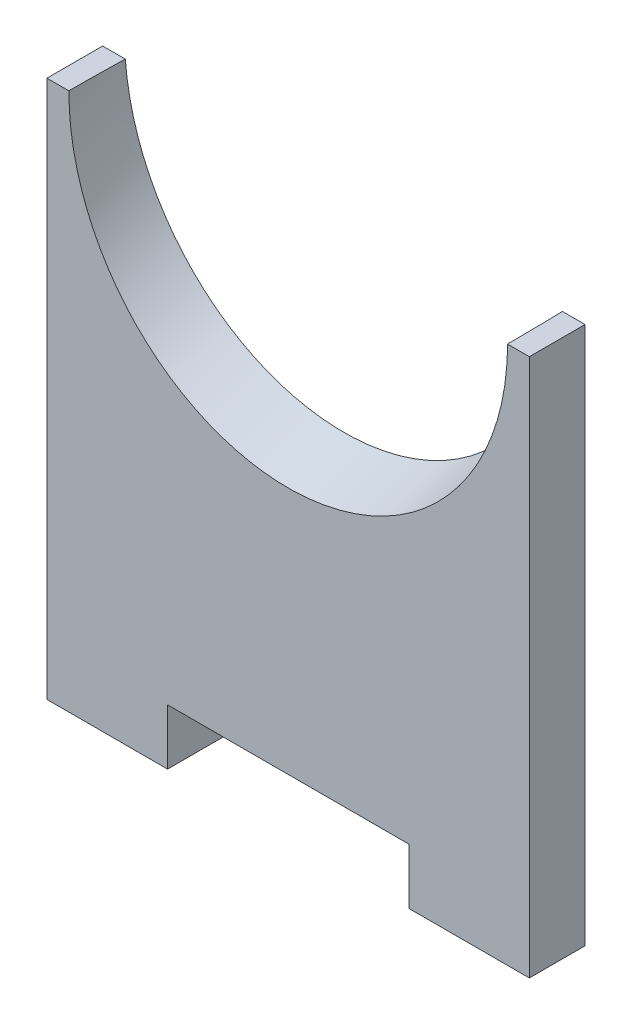
ISO-10303-21;
HEADER;
FILE_DESCRIPTION(('STEP AP214'),'2;1');
FILE_NAME('part.step','',(''),(''),'','','');
FILE_SCHEMA(('AUTOMOTIVE_DESIGN { 1 0 10303 214 1 1 1 1 }'));
ENDSEC;
DATA;
#1=APPLICATION_CONTEXT('core data for automotive mechanical design processes');
#2=APPLICATION_PROTOCOL_DEFINITION('international standard','automotive_design',2000,#1);
#3=PRODUCT_CONTEXT('',#1,'mechanical');
#4=PRODUCT('Part','Part','',(#3));
#5=PRODUCT_RELATED_PRODUCT_CATEGORY('part','',(#4));
#6=PRODUCT_DEFINITION_FORMATION('','',#4);
#7=PRODUCT_DEFINITION_CONTEXT('part definition',#1,'design');
#8=PRODUCT_DEFINITION('design','',#6,#7);
#9=PRODUCT_DEFINITION_SHAPE('','',#8);
#10=(LENGTH_UNIT() NAMED_UNIT(*) SI_UNIT(.MILLI.,.METRE.));
#11=(NAMED_UNIT(*) PLANE_ANGLE_UNIT() SI_UNIT($,.RADIAN.));
#12=(NAMED_UNIT(*) SI_UNIT($,.STERADIAN.) SOLID_ANGLE_UNIT());
#13=UNCERTAINTY_MEASURE_WITH_UNIT(LENGTH_MEASURE(1.E-05),#10,'distance_accuracy_value','');
#14=(GEOMETRIC_REPRESENTATION_CONTEXT(3) GLOBAL_UNCERTAINTY_ASSIGNED_CONTEXT((#13)) GLOBAL_UNIT_ASSIGNED_CONTEXT((#10,
#11,#12)) REPRESENTATION_CONTEXT('',''));
#15=CARTESIAN_POINT('',(0.,0.,0.));
#16=DIRECTION('',(0.,0.,1.));
#17=DIRECTION('',(1.,0.,0.));
#18=AXIS2_PLACEMENT_3D('',#15,#16,#17);
#19=CARTESIAN_POINT('',(0.,54.999999982,6.35));
#20=DIRECTION('',(0.,-1.,0.));
#21=DIRECTION('',(1.,0.,0.));
#22=AXIS2_PLACEMENT_3D('',#19,#20,#21);
#23=PLANE('',#22);
#24=DIRECTION('',(-1.,0.,0.));
#25=VECTOR('',#24,1.);
#26=CARTESIAN_POINT('',(0.,54.999999982,6.35));
#27=LINE('',#26,#25);
#28=CARTESIAN_POINT('',(2.50020594541714,54.999999982,6.35));
#29=VERTEX_POINT('',#28);
#30=CARTESIAN_POINT('',(0.,54.999999982,6.35));
#31=VERTEX_POINT('',#30);
#32=EDGE_CURVE('E55',#29,#31,#27,.T.);
#33=ORIENTED_EDGE('',*,*,#32,.F.);
#34=CARTESIAN_POINT('',(27.499999991,54.999999982,6.0532723342948));
#35=DIRECTION('',(0.,-1.,0.));
#36=DIRECTION('',(0.,0.,1.));
#37=AXIS2_PLACEMENT_3D('',#34,#35,#36);
#38=ELLIPSE('',#37,73.0951101151822,25.000000038);
#39=CARTESIAN_POINT('',(2.5858736818512,54.999999982,0.));
#40=VERTEX_POINT('',#39);
#41=EDGE_CURVE('E201',#29,#40,#38,.T.);
#42=ORIENTED_EDGE('',*,*,#41,.T.);
#43=DIRECTION('',(-1.,0.,0.));
#44=VECTOR('',#43,1.);
#45=CARTESIAN_POINT('',(0.,54.999999982,0.));
#46=LINE('',#45,#44);
#47=CARTESIAN_POINT('',(0.,54.999999982,0.));
#48=VERTEX_POINT('',#47);
#49=EDGE_CURVE('E90',#40,#48,#46,.T.);
#50=ORIENTED_EDGE('',*,*,#49,.T.);
#51=DIRECTION('',(0.,0.,-1.));
#52=VECTOR('',#51,1.);
#53=CARTESIAN_POINT('',(0.,54.999999982,6.35));
#54=LINE('',#53,#52);
#55=EDGE_CURVE('E145',#31,#48,#54,.T.);
#56=ORIENTED_EDGE('',*,*,#55,.F.);
#57=EDGE_LOOP('',(#33,#42,#50,#56));
#58=FACE_BOUND('',#57,.T.);
#59=ADVANCED_FACE('F32',(#58),#23,.F.);
#60=CARTESIAN_POINT('',(0.,-6.35,6.35));
#61=DIRECTION('',(0.,1.,0.));
#62=DIRECTION('',(0.,0.,1.));
#63=AXIS2_PLACEMENT_3D('',#60,#61,#62);
#64=PLANE('',#63);
#65=DIRECTION('',(1.,0.,0.));
#66=VECTOR('',#65,1.);
#67=CARTESIAN_POINT('',(0.,-6.35,0.));
#68=LINE('',#67,#66);
#69=CARTESIAN_POINT('',(0.,-6.35,0.));
#70=VERTEX_POINT('',#69);
#71=CARTESIAN_POINT('',(13.7499999955,-6.35,0.));
#72=VERTEX_POINT('',#71);
#73=EDGE_CURVE('E146',#70,#72,#68,.T.);
#74=ORIENTED_EDGE('',*,*,#73,.T.);
#75=DIRECTION('',(0.,0.,-1.));
#76=VECTOR('',#75,1.);
#77=CARTESIAN_POINT('',(13.7499999955,-6.35,6.35));
#78=LINE('',#77,#76);
#79=CARTESIAN_POINT('',(13.7499999955,-6.35,6.35));
#80=VERTEX_POINT('',#79);
#81=EDGE_CURVE('E173',#80,#72,#78,.T.);
#82=ORIENTED_EDGE('',*,*,#81,.F.);
#83=DIRECTION('',(1.,0.,0.));
#84=VECTOR('',#83,1.);
#85=CARTESIAN_POINT('',(0.,-6.35,6.35));
#86=LINE('',#85,#84);
#87=CARTESIAN_POINT('',(0.,-6.35,6.35));
#88=VERTEX_POINT('',#87);
#89=EDGE_CURVE('E99',#88,#80,#86,.T.);
#90=ORIENTED_EDGE('',*,*,#89,.F.);
#91=DIRECTION('',(0.,0.,-1.));
#92=VECTOR('',#91,1.);
#93=CARTESIAN_POINT('',(0.,-6.35,6.35));
#94=LINE('',#93,#92);
#95=EDGE_CURVE('E40',#88,#70,#94,.T.);
#96=ORIENTED_EDGE('',*,*,#95,.T.);
#97=EDGE_LOOP('',(#74,#82,#90,#96));
#98=FACE_BOUND('',#97,.T.);
#99=ADVANCED_FACE('F34',(#98),#64,.F.);
#100=CARTESIAN_POINT('',(13.7499999955,0.,6.35));
#101=DIRECTION('',(-1.,0.,0.));
#102=DIRECTION('',(0.,0.,1.));
#103=AXIS2_PLACEMENT_3D('',#100,#101,#102);
#104=PLANE('',#103);
#105=DIRECTION('',(0.,1.,0.));
#106=VECTOR('',#105,1.);
#107=CARTESIAN_POINT('',(13.7499999955,0.,0.));
#108=LINE('',#107,#106);
#109=CARTESIAN_POINT('',(13.7499999955,0.,0.));
#110=VERTEX_POINT('',#109);
#111=EDGE_CURVE('E148',#72,#110,#108,.T.);
#112=ORIENTED_EDGE('',*,*,#111,.T.);
#113=DIRECTION('',(0.,0.,-1.));
#114=VECTOR('',#113,1.);
#115=CARTESIAN_POINT('',(13.7499999955,0.,6.35));
#116=LINE('',#115,#114);
#117=CARTESIAN_POINT('',(13.7499999955,0.,6.35));
#118=VERTEX_POINT('',#117);
#119=EDGE_CURVE('E170',#118,#110,#116,.T.);
#120=ORIENTED_EDGE('',*,*,#119,.F.);
#121=DIRECTION('',(0.,1.,0.));
#122=VECTOR('',#121,1.);
#123=CARTESIAN_POINT('',(13.7499999955,0.,6.35));
#124=LINE('',#123,#122);
#125=EDGE_CURVE('E194',#80,#118,#124,.T.);
#126=ORIENTED_EDGE('',*,*,#125,.F.);
#127=ORIENTED_EDGE('',*,*,#81,.T.);
#128=EDGE_LOOP('',(#112,#120,#126,#127));
#129=FACE_BOUND('',#128,.T.);
#130=ADVANCED_FACE('F187',(#129),#104,.F.);
#131=CARTESIAN_POINT('',(13.7499999955,0.,6.35));
#132=DIRECTION('',(0.,1.,0.));
#133=DIRECTION('',(-1.,0.,0.));
#134=AXIS2_PLACEMENT_3D('',#131,#132,#133);
#135=PLANE('',#134);
#136=DIRECTION('',(1.,0.,0.));
#137=VECTOR('',#136,1.);
#138=CARTESIAN_POINT('',(13.7499999955,0.,0.));
#139=LINE('',#138,#137);
#140=CARTESIAN_POINT('',(41.2499999865,0.,0.));
#141=VERTEX_POINT('',#140);
#142=EDGE_CURVE('E151',#110,#141,#139,.T.);
#143=ORIENTED_EDGE('',*,*,#142,.T.);
#144=DIRECTION('',(0.,0.,-1.));
#145=VECTOR('',#144,1.);
#146=CARTESIAN_POINT('',(41.2499999865,0.,6.35));
#147=LINE('',#146,#145);
#148=CARTESIAN_POINT('',(41.2499999865,0.,6.35));
#149=VERTEX_POINT('',#148);
#150=EDGE_CURVE('E167',#149,#141,#147,.T.);
#151=ORIENTED_EDGE('',*,*,#150,.F.);
#152=DIRECTION('',(1.,0.,0.));
#153=VECTOR('',#152,1.);
#154=CARTESIAN_POINT('',(13.7499999955,0.,6.35));
#155=LINE('',#154,#153);
#156=EDGE_CURVE('E193',#118,#149,#155,.T.);
#157=ORIENTED_EDGE('',*,*,#156,.F.);
#158=ORIENTED_EDGE('',*,*,#119,.T.);
#159=EDGE_LOOP('',(#143,#151,#157,#158));
#160=FACE_BOUND('',#159,.T.);
#161=ADVANCED_FACE('F191',(#160),#135,.F.);
#162=CARTESIAN_POINT('',(41.2499999865,0.,6.35));
#163=DIRECTION('',(1.,0.,0.));
#164=DIRECTION('',(0.,0.,-1.));
#165=AXIS2_PLACEMENT_3D('',#162,#163,#164);
#166=PLANE('',#165);
#167=DIRECTION('',(0.,-1.,0.));
#168=VECTOR('',#167,1.);
#169=CARTESIAN_POINT('',(41.2499999865,0.,0.));
#170=LINE('',#169,#168);
#171=CARTESIAN_POINT('',(41.2499999865,-6.35,0.));
#172=VERTEX_POINT('',#171);
#173=EDGE_CURVE('E153',#141,#172,#170,.T.);
#174=ORIENTED_EDGE('',*,*,#173,.T.);
#175=DIRECTION('',(0.,0.,-1.));
#176=VECTOR('',#175,1.);
#177=CARTESIAN_POINT('',(41.2499999865,-6.35,6.35));
#178=LINE('',#177,#176);
#179=CARTESIAN_POINT('',(41.2499999865,-6.35,6.35));
#180=VERTEX_POINT('',#179);
#181=EDGE_CURVE('E134',#180,#172,#178,.T.);
#182=ORIENTED_EDGE('',*,*,#181,.F.);
#183=DIRECTION('',(0.,-1.,0.));
#184=VECTOR('',#183,1.);
#185=CARTESIAN_POINT('',(41.2499999865,0.,6.35));
#186=LINE('',#185,#184);
#187=EDGE_CURVE('E122',#149,#180,#186,.T.);
#188=ORIENTED_EDGE('',*,*,#187,.F.);
#189=ORIENTED_EDGE('',*,*,#150,.T.);
#190=EDGE_LOOP('',(#174,#182,#188,#189));
#191=FACE_BOUND('',#190,.T.);
#192=ADVANCED_FACE('F232',(#191),#166,.F.);
#193=CARTESIAN_POINT('',(54.999999982,-6.34999999999999,6.35));
#194=DIRECTION('',(0.,1.,0.));
#195=DIRECTION('',(-1.,0.,0.));
#196=AXIS2_PLACEMENT_3D('',#193,#194,#195);
#197=PLANE('',#196);
#198=DIRECTION('',(1.,0.,0.));
#199=VECTOR('',#198,1.);
#200=CARTESIAN_POINT('',(54.999999982,-6.34999999999999,0.));
#201=LINE('',#200,#199);
#202=CARTESIAN_POINT('',(54.999999982,-6.34999999999999,0.));
#203=VERTEX_POINT('',#202);
#204=EDGE_CURVE('E132',#172,#203,#201,.T.);
#205=ORIENTED_EDGE('',*,*,#204,.T.);
#206=DIRECTION('',(0.,0.,-1.));
#207=VECTOR('',#206,1.);
#208=CARTESIAN_POINT('',(54.999999982,-6.34999999999999,6.35));
#209=LINE('',#208,#207);
#210=CARTESIAN_POINT('',(54.999999982,-6.34999999999999,6.35));
#211=VERTEX_POINT('',#210);
#212=EDGE_CURVE('E129',#211,#203,#209,.T.);
#213=ORIENTED_EDGE('',*,*,#212,.F.);
#214=DIRECTION('',(1.,0.,0.));
#215=VECTOR('',#214,1.);
#216=CARTESIAN_POINT('',(54.999999982,-6.34999999999999,6.35));
#217=LINE('',#216,#215);
#218=EDGE_CURVE('E114',#180,#211,#217,.T.);
#219=ORIENTED_EDGE('',*,*,#218,.F.);
#220=ORIENTED_EDGE('',*,*,#181,.T.);
#221=EDGE_LOOP('',(#205,#213,#219,#220));
#222=FACE_BOUND('',#221,.T.);
#223=ADVANCED_FACE('F130',(#222),#197,.F.);
#224=CARTESIAN_POINT('',(54.999999982,0.,6.35));
#225=DIRECTION('',(-1.,0.,0.));
#226=DIRECTION('',(0.,-1.,0.));
#227=AXIS2_PLACEMENT_3D('',#224,#225,#226);
#228=PLANE('',#227);
#229=DIRECTION('',(0.,1.,0.));
#230=VECTOR('',#229,1.);
#231=CARTESIAN_POINT('',(54.999999982,0.,0.));
#232=LINE('',#231,#230);
#233=CARTESIAN_POINT('',(54.999999982,54.999999982,0.));
#234=VERTEX_POINT('',#233);
#235=EDGE_CURVE('E156',#203,#234,#232,.T.);
#236=ORIENTED_EDGE('',*,*,#235,.T.);
#237=DIRECTION('',(0.,0.,-1.));
#238=VECTOR('',#237,1.);
#239=CARTESIAN_POINT('',(54.999999982,54.999999982,6.35));
#240=LINE('',#239,#238);
#241=CARTESIAN_POINT('',(54.999999982,54.999999982,6.35));
#242=VERTEX_POINT('',#241);
#243=EDGE_CURVE('E135',#242,#234,#240,.T.);
#244=ORIENTED_EDGE('',*,*,#243,.F.);
#245=DIRECTION('',(0.,1.,0.));
#246=VECTOR('',#245,1.);
#247=CARTESIAN_POINT('',(54.999999982,0.,6.35));
#248=LINE('',#247,#246);
#249=EDGE_CURVE('E119',#211,#242,#248,.T.);
#250=ORIENTED_EDGE('',*,*,#249,.F.);
#251=ORIENTED_EDGE('',*,*,#212,.T.);
#252=EDGE_LOOP('',(#236,#244,#250,#251));
#253=FACE_BOUND('',#252,.T.);
#254=ADVANCED_FACE('F137',(#253),#228,.F.);
#255=CARTESIAN_POINT('',(52.4141263001488,54.999999982,0.));
#256=VERTEX_POINT('',#255);
#257=EDGE_CURVE('E158',#234,#256,#46,.T.);
#258=ORIENTED_EDGE('',*,*,#257,.T.);
#259=CARTESIAN_POINT('',(52.4997940365828,54.999999982,6.35));
#260=VERTEX_POINT('',#259);
#261=EDGE_CURVE('E47',#256,#260,#38,.T.);
#262=ORIENTED_EDGE('',*,*,#261,.T.);
#263=EDGE_CURVE('E141',#242,#260,#27,.T.);
#264=ORIENTED_EDGE('',*,*,#263,.F.);
#265=ORIENTED_EDGE('',*,*,#243,.T.);
#266=EDGE_LOOP('',(#258,#262,#264,#265));
#267=FACE_BOUND('',#266,.T.);
#268=ADVANCED_FACE('F208',(#267),#23,.F.);
#269=CARTESIAN_POINT('',(0.,0.,6.35));
#270=DIRECTION('',(1.,0.,0.));
#271=DIRECTION('',(0.,0.,-1.));
#272=AXIS2_PLACEMENT_3D('',#269,#270,#271);
#273=PLANE('',#272);
#274=DIRECTION('',(0.,-1.,0.));
#275=VECTOR('',#274,1.);
#276=CARTESIAN_POINT('',(0.,0.,0.));
#277=LINE('',#276,#275);
#278=EDGE_CURVE('E161',#48,#70,#277,.T.);
#279=ORIENTED_EDGE('',*,*,#278,.T.);
#280=ORIENTED_EDGE('',*,*,#95,.F.);
#281=DIRECTION('',(0.,-1.,0.));
#282=VECTOR('',#281,1.);
#283=CARTESIAN_POINT('',(0.,0.,6.35));
#284=LINE('',#283,#282);
#285=EDGE_CURVE('E163',#31,#88,#284,.T.);
#286=ORIENTED_EDGE('',*,*,#285,.F.);
#287=ORIENTED_EDGE('',*,*,#55,.T.);
#288=EDGE_LOOP('',(#279,#280,#286,#287));
#289=FACE_BOUND('',#288,.T.);
#290=ADVANCED_FACE('F178',(#289),#273,.F.);
#291=CARTESIAN_POINT('',(0.,0.,6.35));
#292=DIRECTION('',(0.,0.,1.));
#293=DIRECTION('',(1.,0.,0.));
#294=AXIS2_PLACEMENT_3D('',#291,#292,#293);
#295=PLANE('',#294);
#296=CARTESIAN_POINT('',(27.499999991,54.891999944,6.35));
#297=DIRECTION('',(0.,0.,1.));
#298=DIRECTION('',(0.,-1.,0.));
#299=AXIS2_PLACEMENT_3D('',#296,#297,#298);
#300=ELLIPSE('',#299,26.6044443523365,25.000000038);
#301=EDGE_CURVE('E149',#29,#260,#300,.T.);
#302=ORIENTED_EDGE('',*,*,#301,.F.);
#303=ORIENTED_EDGE('',*,*,#32,.T.);
#304=ORIENTED_EDGE('',*,*,#285,.T.);
#305=ORIENTED_EDGE('',*,*,#89,.T.);
#306=ORIENTED_EDGE('',*,*,#125,.T.);
#307=ORIENTED_EDGE('',*,*,#156,.T.);
#308=ORIENTED_EDGE('',*,*,#187,.T.);
#309=ORIENTED_EDGE('',*,*,#218,.T.);
#310=ORIENTED_EDGE('',*,*,#249,.T.);
#311=ORIENTED_EDGE('',*,*,#263,.T.);
#312=EDGE_LOOP('',(#302,#303,#304,#305,#306,#307,#308,#309,#310,#311));
#313=FACE_BOUND('',#312,.T.);
#314=ADVANCED_FACE('F116',(#313),#295,.T.);
#315=CARTESIAN_POINT('',(0.,0.,0.));
#316=DIRECTION('',(0.,0.,1.));
#317=DIRECTION('',(1.,0.,0.));
#318=AXIS2_PLACEMENT_3D('',#315,#316,#317);
#319=PLANE('',#318);
#320=ORIENTED_EDGE('',*,*,#49,.F.);
#321=CARTESIAN_POINT('',(27.499999991,57.2032109315904,0.));
#322=DIRECTION('',(0.,0.,1.));
#323=DIRECTION('',(0.,-1.,0.));
#324=AXIS2_PLACEMENT_3D('',#321,#322,#323);
#325=ELLIPSE('',#324,26.6044443523365,25.000000038);
#326=EDGE_CURVE('E11',#40,#256,#325,.T.);
#327=ORIENTED_EDGE('',*,*,#326,.T.);
#328=ORIENTED_EDGE('',*,*,#257,.F.);
#329=ORIENTED_EDGE('',*,*,#235,.F.);
#330=ORIENTED_EDGE('',*,*,#204,.F.);
#331=ORIENTED_EDGE('',*,*,#173,.F.);
#332=ORIENTED_EDGE('',*,*,#142,.F.);
#333=ORIENTED_EDGE('',*,*,#111,.F.);
#334=ORIENTED_EDGE('',*,*,#73,.F.);
#335=ORIENTED_EDGE('',*,*,#278,.F.);
#336=EDGE_LOOP('',(#320,#327,#328,#329,#330,#331,#332,#333,#334,#335));
#337=FACE_BOUND('',#336,.T.);
#338=ADVANCED_FACE('F182',(#337),#319,.F.);
#339=CARTESIAN_POINT('',(27.499999991,56.9454842092715,0.708098349961202));
#340=DIRECTION('',(0.,-0.342020143325667,0.939692620785909));
#341=DIRECTION('',(0.,-0.939692620785909,-0.342020143325667));
#342=AXIS2_PLACEMENT_3D('',#339,#340,#341);
#343=CYLINDRICAL_SURFACE('',#342,25.000000038);
#344=ORIENTED_EDGE('',*,*,#301,.T.);
#345=ORIENTED_EDGE('',*,*,#261,.F.);
#346=ORIENTED_EDGE('',*,*,#326,.F.);
#347=ORIENTED_EDGE('',*,*,#41,.F.);
#348=EDGE_LOOP('',(#344,#345,#346,#347));
#349=FACE_BOUND('',#348,.T.);
#350=ADVANCED_FACE('F209',(#349),#343,.F.);
#351=CLOSED_SHELL('',(#59,#99,#130,#161,#192,#223,#254,#268,#290,#314,#338,#350));
#352=MANIFOLD_SOLID_BREP('B2',#351);
#353=ADVANCED_BREP_SHAPE_REPRESENTATION('',(#18,#352),#14);
#354=SHAPE_DEFINITION_REPRESENTATION(#9,#353);
ENDSEC;
END-ISO-10303-21;
